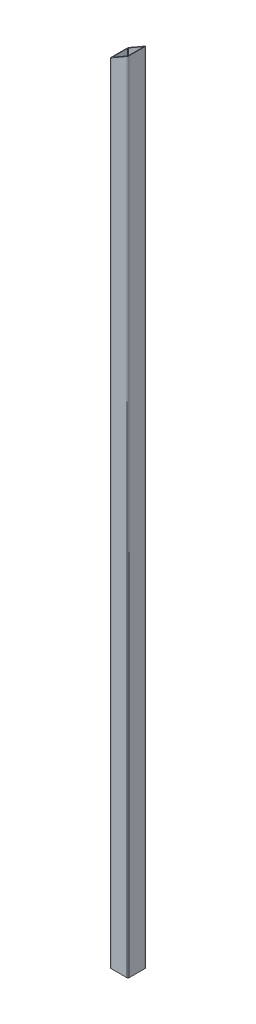
ISO-10303-21;
HEADER;
FILE_DESCRIPTION(('STEP AP214'),'2;1');
FILE_NAME('part.step','',(''),(''),'','','');
FILE_SCHEMA(('AUTOMOTIVE_DESIGN { 1 0 10303 214 1 1 1 1 }'));
ENDSEC;
DATA;
#1=APPLICATION_CONTEXT('core data for automotive mechanical design processes');
#2=APPLICATION_PROTOCOL_DEFINITION('international standard','automotive_design',2000,#1);
#3=PRODUCT_CONTEXT('',#1,'mechanical');
#4=PRODUCT('Part','Part','',(#3));
#5=PRODUCT_RELATED_PRODUCT_CATEGORY('part','',(#4));
#6=PRODUCT_DEFINITION_FORMATION('','',#4);
#7=PRODUCT_DEFINITION_CONTEXT('part definition',#1,'design');
#8=PRODUCT_DEFINITION('design','',#6,#7);
#9=PRODUCT_DEFINITION_SHAPE('','',#8);
#10=(LENGTH_UNIT() NAMED_UNIT(*) SI_UNIT(.MILLI.,.METRE.));
#11=(NAMED_UNIT(*) PLANE_ANGLE_UNIT() SI_UNIT($,.RADIAN.));
#12=(NAMED_UNIT(*) SI_UNIT($,.STERADIAN.) SOLID_ANGLE_UNIT());
#13=UNCERTAINTY_MEASURE_WITH_UNIT(LENGTH_MEASURE(1.E-05),#10,'distance_accuracy_value','');
#14=(GEOMETRIC_REPRESENTATION_CONTEXT(3) GLOBAL_UNCERTAINTY_ASSIGNED_CONTEXT((#13)) GLOBAL_UNIT_ASSIGNED_CONTEXT((#10,
#11,#12)) REPRESENTATION_CONTEXT('',''));
#15=CARTESIAN_POINT('',(0.,0.,0.));
#16=DIRECTION('',(0.,0.,1.));
#17=DIRECTION('',(1.,0.,0.));
#18=AXIS2_PLACEMENT_3D('',#15,#16,#17);
#19=CARTESIAN_POINT('',(-22.,-150.,22.));
#20=DIRECTION('',(0.,1.,0.));
#21=DIRECTION('',(0.,0.,1.));
#22=AXIS2_PLACEMENT_3D('',#19,#20,#21);
#23=CYLINDRICAL_SURFACE('',#22,3.);
#24=DIRECTION('',(0.,1.,0.));
#25=VECTOR('',#24,1.);
#26=CARTESIAN_POINT('',(-22.,-150.,25.));
#27=LINE('',#26,#25);
#28=CARTESIAN_POINT('',(-22.,-150.,25.));
#29=VERTEX_POINT('',#28);
#30=CARTESIAN_POINT('',(-22.,2019.97778600214,25.));
#31=VERTEX_POINT('',#30);
#32=EDGE_CURVE('E38',#29,#31,#27,.T.);
#33=ORIENTED_EDGE('',*,*,#32,.T.);
#34=CARTESIAN_POINT('',(-22.,2019.97778600214,22.));
#35=DIRECTION('',(0.5,-0.866025403784439,0.));
#36=DIRECTION('',(-0.866025403784439,-0.5,0.));
#37=AXIS2_PLACEMENT_3D('',#34,#35,#36);
#38=ELLIPSE('',#37,3.46410161513776,3.);
#39=CARTESIAN_POINT('',(-25.,2018.24573519457,22.));
#40=VERTEX_POINT('',#39);
#41=EDGE_CURVE('E167',#31,#40,#38,.T.);
#42=ORIENTED_EDGE('',*,*,#41,.T.);
#43=DIRECTION('',(0.,1.,0.));
#44=VECTOR('',#43,1.);
#45=CARTESIAN_POINT('',(-25.,-150.,22.));
#46=LINE('',#45,#44);
#47=CARTESIAN_POINT('',(-25.,-150.,22.));
#48=VERTEX_POINT('',#47);
#49=EDGE_CURVE('E11',#48,#40,#46,.T.);
#50=ORIENTED_EDGE('',*,*,#49,.F.);
#51=CARTESIAN_POINT('',(-22.,-150.,22.));
#52=DIRECTION('',(0.,1.,0.));
#53=DIRECTION('',(0.,0.,1.));
#54=AXIS2_PLACEMENT_3D('',#51,#52,#53);
#55=CIRCLE('',#54,3.);
#56=EDGE_CURVE('E234',#48,#29,#55,.T.);
#57=ORIENTED_EDGE('',*,*,#56,.T.);
#58=EDGE_LOOP('',(#33,#42,#50,#57));
#59=FACE_BOUND('',#58,.T.);
#60=ADVANCED_FACE('F35',(#59),#23,.T.);
#61=CARTESIAN_POINT('',(-25.,-150.,-22.));
#62=DIRECTION('',(-1.,0.,0.));
#63=DIRECTION('',(0.,0.,1.));
#64=AXIS2_PLACEMENT_3D('',#61,#62,#63);
#65=PLANE('',#64);
#66=ORIENTED_EDGE('',*,*,#49,.T.);
#67=DIRECTION('',(0.,0.,-1.));
#68=VECTOR('',#67,1.);
#69=CARTESIAN_POINT('',(-25.,2018.24573519457,-22.));
#70=LINE('',#69,#68);
#71=CARTESIAN_POINT('',(-25.,2018.24573519457,-22.));
#72=VERTEX_POINT('',#71);
#73=EDGE_CURVE('E184',#40,#72,#70,.T.);
#74=ORIENTED_EDGE('',*,*,#73,.T.);
#75=DIRECTION('',(0.,1.,0.));
#76=VECTOR('',#75,1.);
#77=CARTESIAN_POINT('',(-25.,-150.,-22.));
#78=LINE('',#77,#76);
#79=CARTESIAN_POINT('',(-25.,-150.,-22.));
#80=VERTEX_POINT('',#79);
#81=EDGE_CURVE('E43',#80,#72,#78,.T.);
#82=ORIENTED_EDGE('',*,*,#81,.F.);
#83=DIRECTION('',(0.,0.,1.));
#84=VECTOR('',#83,1.);
#85=CARTESIAN_POINT('',(-25.,-150.,-22.));
#86=LINE('',#85,#84);
#87=EDGE_CURVE('E264',#80,#48,#86,.T.);
#88=ORIENTED_EDGE('',*,*,#87,.T.);
#89=EDGE_LOOP('',(#66,#74,#82,#88));
#90=FACE_BOUND('',#89,.T.);
#91=ADVANCED_FACE('F293',(#90),#65,.T.);
#92=CARTESIAN_POINT('',(-22.,-150.,-22.));
#93=DIRECTION('',(0.,1.,0.));
#94=DIRECTION('',(0.,0.,1.));
#95=AXIS2_PLACEMENT_3D('',#92,#93,#94);
#96=CYLINDRICAL_SURFACE('',#95,3.);
#97=ORIENTED_EDGE('',*,*,#81,.T.);
#98=CARTESIAN_POINT('',(-22.,2019.97778600214,-22.));
#99=DIRECTION('',(0.5,-0.866025403784439,0.));
#100=DIRECTION('',(-0.866025403784439,-0.5,0.));
#101=AXIS2_PLACEMENT_3D('',#98,#99,#100);
#102=ELLIPSE('',#101,3.46410161513776,3.);
#103=CARTESIAN_POINT('',(-22.,2019.97778600214,-25.));
#104=VERTEX_POINT('',#103);
#105=EDGE_CURVE('E181',#72,#104,#102,.T.);
#106=ORIENTED_EDGE('',*,*,#105,.T.);
#107=DIRECTION('',(0.,1.,0.));
#108=VECTOR('',#107,1.);
#109=CARTESIAN_POINT('',(-22.,-150.,-25.));
#110=LINE('',#109,#108);
#111=CARTESIAN_POINT('',(-22.,-150.,-25.));
#112=VERTEX_POINT('',#111);
#113=EDGE_CURVE('E268',#112,#104,#110,.T.);
#114=ORIENTED_EDGE('',*,*,#113,.F.);
#115=CARTESIAN_POINT('',(-22.,-150.,-22.));
#116=DIRECTION('',(0.,1.,0.));
#117=DIRECTION('',(0.,0.,1.));
#118=AXIS2_PLACEMENT_3D('',#115,#116,#117);
#119=CIRCLE('',#118,3.);
#120=EDGE_CURVE('E261',#112,#80,#119,.T.);
#121=ORIENTED_EDGE('',*,*,#120,.T.);
#122=EDGE_LOOP('',(#97,#106,#114,#121));
#123=FACE_BOUND('',#122,.T.);
#124=ADVANCED_FACE('F290',(#123),#96,.T.);
#125=CARTESIAN_POINT('',(-22.,-150.,-25.));
#126=DIRECTION('',(0.,0.,-1.));
#127=DIRECTION('',(-1.,0.,0.));
#128=AXIS2_PLACEMENT_3D('',#125,#126,#127);
#129=PLANE('',#128);
#130=ORIENTED_EDGE('',*,*,#113,.T.);
#131=DIRECTION('',(0.866025403784439,0.5,0.));
#132=VECTOR('',#131,1.);
#133=CARTESIAN_POINT('',(16.4869804220584,2042.19825450911,-25.));
#134=LINE('',#133,#132);
#135=CARTESIAN_POINT('',(22.,2045.38119784648,-25.));
#136=VERTEX_POINT('',#135);
#137=EDGE_CURVE('E178',#104,#136,#134,.T.);
#138=ORIENTED_EDGE('',*,*,#137,.T.);
#139=DIRECTION('',(0.,1.,0.));
#140=VECTOR('',#139,1.);
#141=CARTESIAN_POINT('',(22.,-150.,-25.));
#142=LINE('',#141,#140);
#143=CARTESIAN_POINT('',(22.,-150.,-25.));
#144=VERTEX_POINT('',#143);
#145=EDGE_CURVE('E270',#144,#136,#142,.T.);
#146=ORIENTED_EDGE('',*,*,#145,.F.);
#147=DIRECTION('',(-1.,0.,0.));
#148=VECTOR('',#147,1.);
#149=CARTESIAN_POINT('',(-22.,-150.,-25.));
#150=LINE('',#149,#148);
#151=EDGE_CURVE('E258',#144,#112,#150,.T.);
#152=ORIENTED_EDGE('',*,*,#151,.T.);
#153=EDGE_LOOP('',(#130,#138,#146,#152));
#154=FACE_BOUND('',#153,.T.);
#155=ADVANCED_FACE('F284',(#154),#129,.T.);
#156=CARTESIAN_POINT('',(22.,-150.,-22.));
#157=DIRECTION('',(0.,1.,0.));
#158=DIRECTION('',(0.,0.,1.));
#159=AXIS2_PLACEMENT_3D('',#156,#157,#158);
#160=CYLINDRICAL_SURFACE('',#159,3.00000000000001);
#161=ORIENTED_EDGE('',*,*,#145,.T.);
#162=CARTESIAN_POINT('',(22.,2045.38119784648,-22.));
#163=DIRECTION('',(0.5,-0.866025403784439,0.));
#164=DIRECTION('',(-0.866025403784439,-0.5,0.));
#165=AXIS2_PLACEMENT_3D('',#162,#163,#164);
#166=ELLIPSE('',#165,3.46410161513776,3.00000000000001);
#167=CARTESIAN_POINT('',(25.,2047.11324865405,-22.));
#168=VERTEX_POINT('',#167);
#169=EDGE_CURVE('E172',#136,#168,#166,.T.);
#170=ORIENTED_EDGE('',*,*,#169,.T.);
#171=DIRECTION('',(0.,1.,0.));
#172=VECTOR('',#171,1.);
#173=CARTESIAN_POINT('',(25.,-150.,-22.));
#174=LINE('',#173,#172);
#175=CARTESIAN_POINT('',(25.,-150.,-22.));
#176=VERTEX_POINT('',#175);
#177=EDGE_CURVE('E272',#176,#168,#174,.T.);
#178=ORIENTED_EDGE('',*,*,#177,.F.);
#179=CARTESIAN_POINT('',(22.,-150.,-22.));
#180=DIRECTION('',(0.,1.,0.));
#181=DIRECTION('',(0.,0.,-1.));
#182=AXIS2_PLACEMENT_3D('',#179,#180,#181);
#183=CIRCLE('',#182,3.00000000000001);
#184=EDGE_CURVE('E255',#176,#144,#183,.T.);
#185=ORIENTED_EDGE('',*,*,#184,.T.);
#186=EDGE_LOOP('',(#161,#170,#178,#185));
#187=FACE_BOUND('',#186,.T.);
#188=ADVANCED_FACE('F281',(#187),#160,.T.);
#189=CARTESIAN_POINT('',(25.,-150.,-22.));
#190=DIRECTION('',(1.,0.,0.));
#191=DIRECTION('',(0.,0.,-1.));
#192=AXIS2_PLACEMENT_3D('',#189,#190,#191);
#193=PLANE('',#192);
#194=ORIENTED_EDGE('',*,*,#177,.T.);
#195=DIRECTION('',(0.,0.,1.));
#196=VECTOR('',#195,1.);
#197=CARTESIAN_POINT('',(25.,2047.11324865405,-22.));
#198=LINE('',#197,#196);
#199=CARTESIAN_POINT('',(25.,2047.11324865405,22.));
#200=VERTEX_POINT('',#199);
#201=EDGE_CURVE('E170',#168,#200,#198,.T.);
#202=ORIENTED_EDGE('',*,*,#201,.T.);
#203=DIRECTION('',(0.,1.,0.));
#204=VECTOR('',#203,1.);
#205=CARTESIAN_POINT('',(25.,-150.,22.));
#206=LINE('',#205,#204);
#207=CARTESIAN_POINT('',(25.,-150.,22.));
#208=VERTEX_POINT('',#207);
#209=EDGE_CURVE('E158',#208,#200,#206,.T.);
#210=ORIENTED_EDGE('',*,*,#209,.F.);
#211=DIRECTION('',(0.,0.,-1.));
#212=VECTOR('',#211,1.);
#213=CARTESIAN_POINT('',(25.,-150.,-22.));
#214=LINE('',#213,#212);
#215=EDGE_CURVE('E252',#208,#176,#214,.T.);
#216=ORIENTED_EDGE('',*,*,#215,.T.);
#217=EDGE_LOOP('',(#194,#202,#210,#216));
#218=FACE_BOUND('',#217,.T.);
#219=ADVANCED_FACE('F275',(#218),#193,.T.);
#220=CARTESIAN_POINT('',(22.,-150.,22.));
#221=DIRECTION('',(0.,1.,0.));
#222=DIRECTION('',(0.,0.,1.));
#223=AXIS2_PLACEMENT_3D('',#220,#221,#222);
#224=CYLINDRICAL_SURFACE('',#223,3.);
#225=ORIENTED_EDGE('',*,*,#209,.T.);
#226=CARTESIAN_POINT('',(22.,2045.38119784648,22.));
#227=DIRECTION('',(0.5,-0.866025403784439,0.));
#228=DIRECTION('',(-0.866025403784439,-0.5,0.));
#229=AXIS2_PLACEMENT_3D('',#226,#227,#228);
#230=ELLIPSE('',#229,3.46410161513775,3.);
#231=CARTESIAN_POINT('',(22.,2045.38119784648,25.));
#232=VERTEX_POINT('',#231);
#233=EDGE_CURVE('E164',#200,#232,#230,.T.);
#234=ORIENTED_EDGE('',*,*,#233,.T.);
#235=DIRECTION('',(0.,1.,0.));
#236=VECTOR('',#235,1.);
#237=CARTESIAN_POINT('',(22.,-150.,25.));
#238=LINE('',#237,#236);
#239=CARTESIAN_POINT('',(22.,-150.,25.));
#240=VERTEX_POINT('',#239);
#241=EDGE_CURVE('E148',#240,#232,#238,.T.);
#242=ORIENTED_EDGE('',*,*,#241,.F.);
#243=CARTESIAN_POINT('',(22.,-150.,22.));
#244=DIRECTION('',(0.,1.,0.));
#245=DIRECTION('',(0.,0.,1.));
#246=AXIS2_PLACEMENT_3D('',#243,#244,#245);
#247=CIRCLE('',#246,3.);
#248=EDGE_CURVE('E250',#240,#208,#247,.T.);
#249=ORIENTED_EDGE('',*,*,#248,.T.);
#250=EDGE_LOOP('',(#225,#234,#242,#249));
#251=FACE_BOUND('',#250,.T.);
#252=ADVANCED_FACE('F169',(#251),#224,.T.);
#253=CARTESIAN_POINT('',(-22.,-150.,25.));
#254=DIRECTION('',(0.,0.,1.));
#255=DIRECTION('',(1.,0.,0.));
#256=AXIS2_PLACEMENT_3D('',#253,#254,#255);
#257=PLANE('',#256);
#258=ORIENTED_EDGE('',*,*,#241,.T.);
#259=DIRECTION('',(-0.866025403784439,-0.5,0.));
#260=VECTOR('',#259,1.);
#261=CARTESIAN_POINT('',(16.4869804220584,2042.19825450911,25.));
#262=LINE('',#261,#260);
#263=EDGE_CURVE('E151',#232,#31,#262,.T.);
#264=ORIENTED_EDGE('',*,*,#263,.T.);
#265=ORIENTED_EDGE('',*,*,#32,.F.);
#266=DIRECTION('',(1.,0.,0.));
#267=VECTOR('',#266,1.);
#268=CARTESIAN_POINT('',(-22.,-150.,25.));
#269=LINE('',#268,#267);
#270=EDGE_CURVE('E153',#29,#240,#269,.T.);
#271=ORIENTED_EDGE('',*,*,#270,.T.);
#272=EDGE_LOOP('',(#258,#264,#265,#271));
#273=FACE_BOUND('',#272,.T.);
#274=ADVANCED_FACE('F150',(#273),#257,.T.);
#275=CARTESIAN_POINT('',(-22.,-150.,22.));
#276=DIRECTION('',(0.,1.,0.));
#277=DIRECTION('',(0.,0.,1.));
#278=AXIS2_PLACEMENT_3D('',#275,#276,#277);
#279=PLANE('',#278);
#280=DIRECTION('',(0.,0.,1.));
#281=VECTOR('',#280,1.);
#282=CARTESIAN_POINT('',(-22.,-150.,-20.));
#283=LINE('',#282,#281);
#284=CARTESIAN_POINT('',(-22.,-150.,-20.));
#285=VERTEX_POINT('',#284);
#286=CARTESIAN_POINT('',(-22.,-150.,20.));
#287=VERTEX_POINT('',#286);
#288=EDGE_CURVE('E228',#285,#287,#283,.T.);
#289=ORIENTED_EDGE('',*,*,#288,.T.);
#290=CARTESIAN_POINT('',(-20.,-150.,20.));
#291=DIRECTION('',(0.,1.,0.));
#292=DIRECTION('',(0.,0.,1.));
#293=AXIS2_PLACEMENT_3D('',#290,#291,#292);
#294=CIRCLE('',#293,2.);
#295=CARTESIAN_POINT('',(-20.,-150.,22.));
#296=VERTEX_POINT('',#295);
#297=EDGE_CURVE('E194',#287,#296,#294,.T.);
#298=ORIENTED_EDGE('',*,*,#297,.T.);
#299=DIRECTION('',(1.,0.,0.));
#300=VECTOR('',#299,1.);
#301=CARTESIAN_POINT('',(-20.,-150.,22.));
#302=LINE('',#301,#300);
#303=CARTESIAN_POINT('',(20.,-150.,22.));
#304=VERTEX_POINT('',#303);
#305=EDGE_CURVE('E212',#296,#304,#302,.T.);
#306=ORIENTED_EDGE('',*,*,#305,.T.);
#307=CARTESIAN_POINT('',(20.,-150.,20.));
#308=DIRECTION('',(0.,1.,0.));
#309=DIRECTION('',(0.,0.,1.));
#310=AXIS2_PLACEMENT_3D('',#307,#308,#309);
#311=CIRCLE('',#310,2.);
#312=CARTESIAN_POINT('',(22.,-150.,20.));
#313=VERTEX_POINT('',#312);
#314=EDGE_CURVE('E51',#304,#313,#311,.T.);
#315=ORIENTED_EDGE('',*,*,#314,.T.);
#316=DIRECTION('',(0.,0.,-1.));
#317=VECTOR('',#316,1.);
#318=CARTESIAN_POINT('',(22.,-150.,-20.));
#319=LINE('',#318,#317);
#320=CARTESIAN_POINT('',(22.,-150.,-20.));
#321=VERTEX_POINT('',#320);
#322=EDGE_CURVE('E216',#313,#321,#319,.T.);
#323=ORIENTED_EDGE('',*,*,#322,.T.);
#324=CARTESIAN_POINT('',(20.,-150.,-20.));
#325=DIRECTION('',(0.,1.,0.));
#326=DIRECTION('',(0.,0.,-1.));
#327=AXIS2_PLACEMENT_3D('',#324,#325,#326);
#328=CIRCLE('',#327,2.);
#329=CARTESIAN_POINT('',(20.,-150.,-22.));
#330=VERTEX_POINT('',#329);
#331=EDGE_CURVE('E219',#321,#330,#328,.T.);
#332=ORIENTED_EDGE('',*,*,#331,.T.);
#333=DIRECTION('',(-1.,0.,0.));
#334=VECTOR('',#333,1.);
#335=CARTESIAN_POINT('',(-20.,-150.,-22.));
#336=LINE('',#335,#334);
#337=CARTESIAN_POINT('',(-20.,-150.,-22.));
#338=VERTEX_POINT('',#337);
#339=EDGE_CURVE('E222',#330,#338,#336,.T.);
#340=ORIENTED_EDGE('',*,*,#339,.T.);
#341=CARTESIAN_POINT('',(-20.,-150.,-20.));
#342=DIRECTION('',(0.,1.,0.));
#343=DIRECTION('',(0.,0.,1.));
#344=AXIS2_PLACEMENT_3D('',#341,#342,#343);
#345=CIRCLE('',#344,2.);
#346=EDGE_CURVE('E225',#338,#285,#345,.T.);
#347=ORIENTED_EDGE('',*,*,#346,.T.);
#348=EDGE_LOOP('',(#289,#298,#306,#315,#323,#332,#340,#347));
#349=FACE_BOUND('',#348,.T.);
#350=ORIENTED_EDGE('',*,*,#56,.F.);
#351=ORIENTED_EDGE('',*,*,#87,.F.);
#352=ORIENTED_EDGE('',*,*,#120,.F.);
#353=ORIENTED_EDGE('',*,*,#151,.F.);
#354=ORIENTED_EDGE('',*,*,#184,.F.);
#355=ORIENTED_EDGE('',*,*,#215,.F.);
#356=ORIENTED_EDGE('',*,*,#248,.F.);
#357=ORIENTED_EDGE('',*,*,#270,.F.);
#358=EDGE_LOOP('',(#350,#351,#352,#353,#354,#355,#356,#357));
#359=FACE_BOUND('',#358,.T.);
#360=ADVANCED_FACE('F287',(#349,#359),#279,.F.);
#361=CARTESIAN_POINT('',(-20.,-150.,20.));
#362=DIRECTION('',(0.,1.,0.));
#363=DIRECTION('',(0.,0.,1.));
#364=AXIS2_PLACEMENT_3D('',#361,#362,#363);
#365=CYLINDRICAL_SURFACE('',#364,2.);
#366=DIRECTION('',(0.,1.,0.));
#367=VECTOR('',#366,1.);
#368=CARTESIAN_POINT('',(-22.,-150.,20.));
#369=LINE('',#368,#367);
#370=CARTESIAN_POINT('',(-22.,2019.97778600214,20.));
#371=VERTEX_POINT('',#370);
#372=EDGE_CURVE('E232',#287,#371,#369,.T.);
#373=ORIENTED_EDGE('',*,*,#372,.T.);
#374=CARTESIAN_POINT('',(-20.,2021.13248654052,20.));
#375=DIRECTION('',(0.5,-0.866025403784439,0.));
#376=DIRECTION('',(-0.866025403784439,-0.5,0.));
#377=AXIS2_PLACEMENT_3D('',#374,#375,#376);
#378=ELLIPSE('',#377,2.30940107675851,2.);
#379=CARTESIAN_POINT('',(-20.,2021.13248654052,22.));
#380=VERTEX_POINT('',#379);
#381=EDGE_CURVE('E187',#380,#371,#378,.T.);
#382=ORIENTED_EDGE('',*,*,#381,.F.);
#383=DIRECTION('',(0.,1.,0.));
#384=VECTOR('',#383,1.);
#385=CARTESIAN_POINT('',(-20.,-150.,22.));
#386=LINE('',#385,#384);
#387=EDGE_CURVE('E231',#296,#380,#386,.T.);
#388=ORIENTED_EDGE('',*,*,#387,.F.);
#389=ORIENTED_EDGE('',*,*,#297,.F.);
#390=EDGE_LOOP('',(#373,#382,#388,#389));
#391=FACE_BOUND('',#390,.T.);
#392=ADVANCED_FACE('F315',(#391),#365,.F.);
#393=CARTESIAN_POINT('',(-22.,-150.,-20.));
#394=DIRECTION('',(-1.,0.,0.));
#395=DIRECTION('',(0.,0.,1.));
#396=AXIS2_PLACEMENT_3D('',#393,#394,#395);
#397=PLANE('',#396);
#398=DIRECTION('',(0.,1.,0.));
#399=VECTOR('',#398,1.);
#400=CARTESIAN_POINT('',(-22.,-150.,-20.));
#401=LINE('',#400,#399);
#402=CARTESIAN_POINT('',(-22.,2019.97778600214,-20.));
#403=VERTEX_POINT('',#402);
#404=EDGE_CURVE('E235',#285,#403,#401,.T.);
#405=ORIENTED_EDGE('',*,*,#404,.T.);
#406=DIRECTION('',(0.,0.,-1.));
#407=VECTOR('',#406,1.);
#408=CARTESIAN_POINT('',(-22.,2019.97778600214,-20.));
#409=LINE('',#408,#407);
#410=EDGE_CURVE('E190',#371,#403,#409,.T.);
#411=ORIENTED_EDGE('',*,*,#410,.F.);
#412=ORIENTED_EDGE('',*,*,#372,.F.);
#413=ORIENTED_EDGE('',*,*,#288,.F.);
#414=EDGE_LOOP('',(#405,#411,#412,#413));
#415=FACE_BOUND('',#414,.T.);
#416=ADVANCED_FACE('F320',(#415),#397,.F.);
#417=CARTESIAN_POINT('',(-20.,-150.,-20.));
#418=DIRECTION('',(0.,1.,0.));
#419=DIRECTION('',(0.,0.,1.));
#420=AXIS2_PLACEMENT_3D('',#417,#418,#419);
#421=CYLINDRICAL_SURFACE('',#420,2.);
#422=DIRECTION('',(0.,1.,0.));
#423=VECTOR('',#422,1.);
#424=CARTESIAN_POINT('',(-20.,-150.,-22.));
#425=LINE('',#424,#423);
#426=CARTESIAN_POINT('',(-20.,2021.13248654052,-22.));
#427=VERTEX_POINT('',#426);
#428=EDGE_CURVE('E237',#338,#427,#425,.T.);
#429=ORIENTED_EDGE('',*,*,#428,.T.);
#430=CARTESIAN_POINT('',(-20.,2021.13248654052,-20.));
#431=DIRECTION('',(0.5,-0.866025403784439,0.));
#432=DIRECTION('',(-0.866025403784439,-0.5,0.));
#433=AXIS2_PLACEMENT_3D('',#430,#431,#432);
#434=ELLIPSE('',#433,2.30940107675851,2.);
#435=EDGE_CURVE('E207',#403,#427,#434,.T.);
#436=ORIENTED_EDGE('',*,*,#435,.F.);
#437=ORIENTED_EDGE('',*,*,#404,.F.);
#438=ORIENTED_EDGE('',*,*,#346,.F.);
#439=EDGE_LOOP('',(#429,#436,#437,#438));
#440=FACE_BOUND('',#439,.T.);
#441=ADVANCED_FACE('F347',(#440),#421,.F.);
#442=CARTESIAN_POINT('',(-20.,-150.,-22.));
#443=DIRECTION('',(0.,0.,-1.));
#444=DIRECTION('',(-1.,0.,0.));
#445=AXIS2_PLACEMENT_3D('',#442,#443,#444);
#446=PLANE('',#445);
#447=DIRECTION('',(0.,1.,0.));
#448=VECTOR('',#447,1.);
#449=CARTESIAN_POINT('',(20.,-150.,-22.));
#450=LINE('',#449,#448);
#451=CARTESIAN_POINT('',(20.,2044.2264973081,-22.));
#452=VERTEX_POINT('',#451);
#453=EDGE_CURVE('E239',#330,#452,#450,.T.);
#454=ORIENTED_EDGE('',*,*,#453,.T.);
#455=DIRECTION('',(0.866025403784439,0.5,0.));
#456=VECTOR('',#455,1.);
#457=CARTESIAN_POINT('',(17.9869804220584,2043.06427991289,-22.));
#458=LINE('',#457,#456);
#459=EDGE_CURVE('E204',#427,#452,#458,.T.);
#460=ORIENTED_EDGE('',*,*,#459,.F.);
#461=ORIENTED_EDGE('',*,*,#428,.F.);
#462=ORIENTED_EDGE('',*,*,#339,.F.);
#463=EDGE_LOOP('',(#454,#460,#461,#462));
#464=FACE_BOUND('',#463,.T.);
#465=ADVANCED_FACE('F344',(#464),#446,.F.);
#466=CARTESIAN_POINT('',(20.,-150.,-20.));
#467=DIRECTION('',(0.,1.,0.));
#468=DIRECTION('',(0.,0.,1.));
#469=AXIS2_PLACEMENT_3D('',#466,#467,#468);
#470=CYLINDRICAL_SURFACE('',#469,2.);
#471=DIRECTION('',(0.,1.,0.));
#472=VECTOR('',#471,1.);
#473=CARTESIAN_POINT('',(22.,-150.,-20.));
#474=LINE('',#473,#472);
#475=CARTESIAN_POINT('',(22.,2045.38119784648,-20.));
#476=VERTEX_POINT('',#475);
#477=EDGE_CURVE('E241',#321,#476,#474,.T.);
#478=ORIENTED_EDGE('',*,*,#477,.T.);
#479=CARTESIAN_POINT('',(20.,2044.2264973081,-20.));
#480=DIRECTION('',(0.5,-0.866025403784439,0.));
#481=DIRECTION('',(-0.866025403784439,-0.5,0.));
#482=AXIS2_PLACEMENT_3D('',#479,#480,#481);
#483=ELLIPSE('',#482,2.30940107675851,2.);
#484=EDGE_CURVE('E201',#452,#476,#483,.T.);
#485=ORIENTED_EDGE('',*,*,#484,.F.);
#486=ORIENTED_EDGE('',*,*,#453,.F.);
#487=ORIENTED_EDGE('',*,*,#331,.F.);
#488=EDGE_LOOP('',(#478,#485,#486,#487));
#489=FACE_BOUND('',#488,.T.);
#490=ADVANCED_FACE('F340',(#489),#470,.F.);
#491=CARTESIAN_POINT('',(22.,-150.,-20.));
#492=DIRECTION('',(1.,0.,0.));
#493=DIRECTION('',(0.,0.,-1.));
#494=AXIS2_PLACEMENT_3D('',#491,#492,#493);
#495=PLANE('',#494);
#496=DIRECTION('',(0.,1.,0.));
#497=VECTOR('',#496,1.);
#498=CARTESIAN_POINT('',(22.,-150.,20.));
#499=LINE('',#498,#497);
#500=CARTESIAN_POINT('',(22.,2045.38119784648,20.));
#501=VERTEX_POINT('',#500);
#502=EDGE_CURVE('E243',#313,#501,#499,.T.);
#503=ORIENTED_EDGE('',*,*,#502,.T.);
#504=DIRECTION('',(0.,0.,1.));
#505=VECTOR('',#504,1.);
#506=CARTESIAN_POINT('',(22.,2045.38119784648,-20.));
#507=LINE('',#506,#505);
#508=EDGE_CURVE('E198',#476,#501,#507,.T.);
#509=ORIENTED_EDGE('',*,*,#508,.F.);
#510=ORIENTED_EDGE('',*,*,#477,.F.);
#511=ORIENTED_EDGE('',*,*,#322,.F.);
#512=EDGE_LOOP('',(#503,#509,#510,#511));
#513=FACE_BOUND('',#512,.T.);
#514=ADVANCED_FACE('F336',(#513),#495,.F.);
#515=CARTESIAN_POINT('',(20.,-150.,20.));
#516=DIRECTION('',(0.,1.,0.));
#517=DIRECTION('',(0.,0.,1.));
#518=AXIS2_PLACEMENT_3D('',#515,#516,#517);
#519=CYLINDRICAL_SURFACE('',#518,2.);
#520=DIRECTION('',(0.,1.,0.));
#521=VECTOR('',#520,1.);
#522=CARTESIAN_POINT('',(20.,-150.,22.));
#523=LINE('',#522,#521);
#524=CARTESIAN_POINT('',(20.,2044.2264973081,22.));
#525=VERTEX_POINT('',#524);
#526=EDGE_CURVE('E245',#304,#525,#523,.T.);
#527=ORIENTED_EDGE('',*,*,#526,.T.);
#528=CARTESIAN_POINT('',(20.,2044.2264973081,20.));
#529=DIRECTION('',(0.5,-0.866025403784439,0.));
#530=DIRECTION('',(-0.866025403784439,-0.5,0.));
#531=AXIS2_PLACEMENT_3D('',#528,#529,#530);
#532=ELLIPSE('',#531,2.30940107675851,2.);
#533=EDGE_CURVE('E195',#501,#525,#532,.T.);
#534=ORIENTED_EDGE('',*,*,#533,.F.);
#535=ORIENTED_EDGE('',*,*,#502,.F.);
#536=ORIENTED_EDGE('',*,*,#314,.F.);
#537=EDGE_LOOP('',(#527,#534,#535,#536));
#538=FACE_BOUND('',#537,.T.);
#539=ADVANCED_FACE('F351',(#538),#519,.F.);
#540=CARTESIAN_POINT('',(-20.,-150.,22.));
#541=DIRECTION('',(0.,0.,1.));
#542=DIRECTION('',(1.,0.,0.));
#543=AXIS2_PLACEMENT_3D('',#540,#541,#542);
#544=PLANE('',#543);
#545=ORIENTED_EDGE('',*,*,#387,.T.);
#546=DIRECTION('',(-0.866025403784439,-0.5,0.));
#547=VECTOR('',#546,1.);
#548=CARTESIAN_POINT('',(17.9869804220584,2043.06427991289,22.));
#549=LINE('',#548,#547);
#550=EDGE_CURVE('E191',#525,#380,#549,.T.);
#551=ORIENTED_EDGE('',*,*,#550,.F.);
#552=ORIENTED_EDGE('',*,*,#526,.F.);
#553=ORIENTED_EDGE('',*,*,#305,.F.);
#554=EDGE_LOOP('',(#545,#551,#552,#553));
#555=FACE_BOUND('',#554,.T.);
#556=ADVANCED_FACE('F332',(#555),#544,.F.);
#557=CARTESIAN_POINT('',(1672.50000000001,2998.29781714396,22.0000000000005));
#558=DIRECTION('',(0.5,-0.866025403784439,0.));
#559=DIRECTION('',(0.,0.,1.));
#560=AXIS2_PLACEMENT_3D('',#557,#558,#559);
#561=PLANE('',#560);
#562=ORIENTED_EDGE('',*,*,#381,.T.);
#563=ORIENTED_EDGE('',*,*,#410,.T.);
#564=ORIENTED_EDGE('',*,*,#435,.T.);
#565=ORIENTED_EDGE('',*,*,#459,.T.);
#566=ORIENTED_EDGE('',*,*,#484,.T.);
#567=ORIENTED_EDGE('',*,*,#508,.T.);
#568=ORIENTED_EDGE('',*,*,#533,.T.);
#569=ORIENTED_EDGE('',*,*,#550,.T.);
#570=EDGE_LOOP('',(#562,#563,#564,#565,#566,#567,#568,#569));
#571=FACE_BOUND('',#570,.T.);
#572=ORIENTED_EDGE('',*,*,#263,.F.);
#573=ORIENTED_EDGE('',*,*,#233,.F.);
#574=ORIENTED_EDGE('',*,*,#201,.F.);
#575=ORIENTED_EDGE('',*,*,#169,.F.);
#576=ORIENTED_EDGE('',*,*,#137,.F.);
#577=ORIENTED_EDGE('',*,*,#105,.F.);
#578=ORIENTED_EDGE('',*,*,#73,.F.);
#579=ORIENTED_EDGE('',*,*,#41,.F.);
#580=EDGE_LOOP('',(#572,#573,#574,#575,#576,#577,#578,#579));
#581=FACE_BOUND('',#580,.T.);
#582=ADVANCED_FACE('F162',(#571,#581),#561,.F.);
#583=CLOSED_SHELL('',(#60,#91,#124,#155,#188,#219,#252,#274,#360,#392,#416,#441,#465,#490,#514,
#539,#556,#582));
#584=MANIFOLD_SOLID_BREP('B2',#583);
#585=ADVANCED_BREP_SHAPE_REPRESENTATION('',(#18,#584),#14);
#586=SHAPE_DEFINITION_REPRESENTATION(#9,#585);
ENDSEC;
END-ISO-10303-21;
